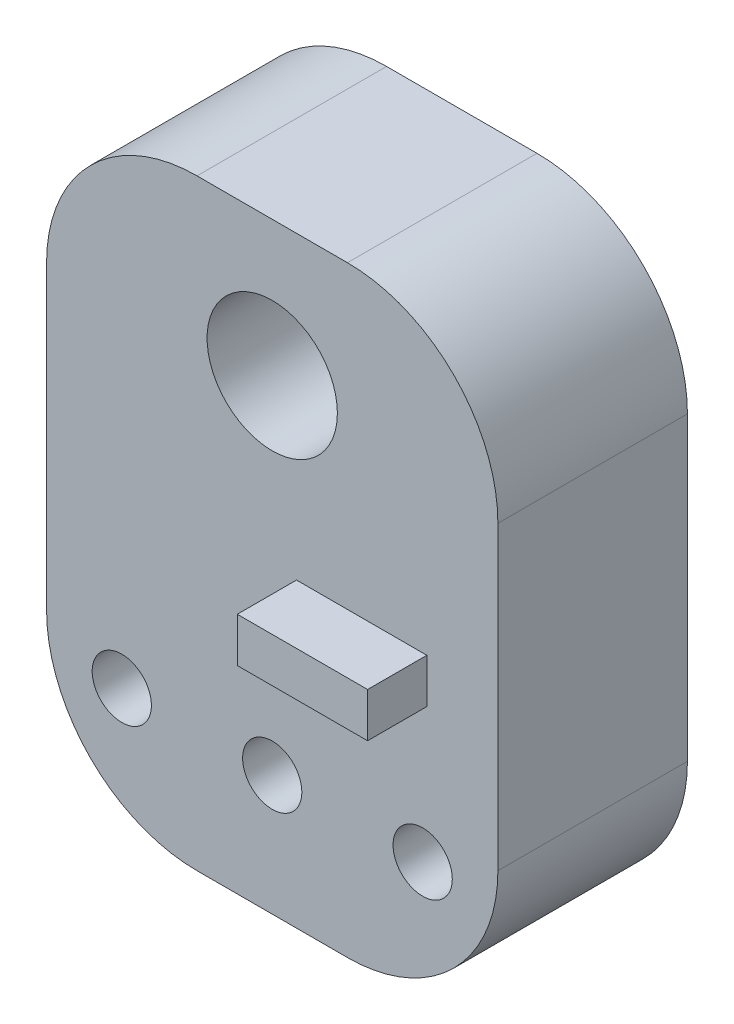
ISO-10303-21;
HEADER;
FILE_DESCRIPTION(('STEP AP214'),'2;1');
FILE_NAME('part.step','',(''),(''),'','','');
FILE_SCHEMA(('AUTOMOTIVE_DESIGN { 1 0 10303 214 1 1 1 1 }'));
ENDSEC;
DATA;
#1=APPLICATION_CONTEXT('core data for automotive mechanical design processes');
#2=APPLICATION_PROTOCOL_DEFINITION('international standard','automotive_design',2000,#1);
#3=PRODUCT_CONTEXT('',#1,'mechanical');
#4=PRODUCT('Part','Part','',(#3));
#5=PRODUCT_RELATED_PRODUCT_CATEGORY('part','',(#4));
#6=PRODUCT_DEFINITION_FORMATION('','',#4);
#7=PRODUCT_DEFINITION_CONTEXT('part definition',#1,'design');
#8=PRODUCT_DEFINITION('design','',#6,#7);
#9=PRODUCT_DEFINITION_SHAPE('','',#8);
#10=(LENGTH_UNIT() NAMED_UNIT(*) SI_UNIT(.MILLI.,.METRE.));
#11=(NAMED_UNIT(*) PLANE_ANGLE_UNIT() SI_UNIT($,.RADIAN.));
#12=(NAMED_UNIT(*) SI_UNIT($,.STERADIAN.) SOLID_ANGLE_UNIT());
#13=UNCERTAINTY_MEASURE_WITH_UNIT(LENGTH_MEASURE(1.E-05),#10,'distance_accuracy_value','');
#14=(GEOMETRIC_REPRESENTATION_CONTEXT(3) GLOBAL_UNCERTAINTY_ASSIGNED_CONTEXT((#13)) GLOBAL_UNIT_ASSIGNED_CONTEXT((#10,
#11,#12)) REPRESENTATION_CONTEXT('',''));
#15=CARTESIAN_POINT('',(0.,0.,0.));
#16=DIRECTION('',(0.,0.,1.));
#17=DIRECTION('',(1.,0.,0.));
#18=AXIS2_PLACEMENT_3D('',#15,#16,#17);
#19=CARTESIAN_POINT('',(20.068312942279,7.62,3.2));
#20=DIRECTION('',(0.,0.,1.));
#21=DIRECTION('',(1.,0.,0.));
#22=AXIS2_PLACEMENT_3D('',#19,#20,#21);
#23=PLANE('',#22);
#24=CARTESIAN_POINT('',(23.878312942279,2.032,3.2));
#25=DIRECTION('',(0.,0.,1.));
#26=DIRECTION('',(1.,0.,0.));
#27=AXIS2_PLACEMENT_3D('',#24,#25,#26);
#28=CIRCLE('',#27,0.499999999999999);
#29=CARTESIAN_POINT('',(24.378312942279,2.032,3.2));
#30=VERTEX_POINT('',#29);
#31=EDGE_CURVE('E207',#30,#30,#28,.T.);
#32=ORIENTED_EDGE('',*,*,#31,.F.);
#33=EDGE_LOOP('',(#32));
#34=FACE_BOUND('',#33,.T.);
#35=CARTESIAN_POINT('',(18.798312942279,2.032,3.2));
#36=DIRECTION('',(0.,0.,1.));
#37=DIRECTION('',(1.,0.,0.));
#38=AXIS2_PLACEMENT_3D('',#35,#36,#37);
#39=CIRCLE('',#38,0.499999999999999);
#40=CARTESIAN_POINT('',(19.298312942279,2.032,3.2));
#41=VERTEX_POINT('',#40);
#42=EDGE_CURVE('E152',#41,#41,#39,.T.);
#43=ORIENTED_EDGE('',*,*,#42,.F.);
#44=EDGE_LOOP('',(#43));
#45=FACE_BOUND('',#44,.T.);
#46=CARTESIAN_POINT('',(20.068312942279,7.62,3.2));
#47=DIRECTION('',(0.,0.,1.));
#48=DIRECTION('',(1.,0.,0.));
#49=AXIS2_PLACEMENT_3D('',#46,#47,#48);
#50=CIRCLE('',#49,2.54);
#51=CARTESIAN_POINT('',(20.068312942279,10.16,3.2));
#52=VERTEX_POINT('',#51);
#53=CARTESIAN_POINT('',(17.528312942279,7.62,3.2));
#54=VERTEX_POINT('',#53);
#55=EDGE_CURVE('E164',#52,#54,#50,.T.);
#56=ORIENTED_EDGE('',*,*,#55,.T.);
#57=DIRECTION('',(0.,-1.,0.));
#58=VECTOR('',#57,1.);
#59=CARTESIAN_POINT('',(17.528312942279,7.62,3.2));
#60=LINE('',#59,#58);
#61=CARTESIAN_POINT('',(17.528312942279,2.54,3.2));
#62=VERTEX_POINT('',#61);
#63=EDGE_CURVE('E104',#54,#62,#60,.T.);
#64=ORIENTED_EDGE('',*,*,#63,.T.);
#65=CARTESIAN_POINT('',(20.068312942279,2.54,3.2));
#66=DIRECTION('',(0.,0.,1.));
#67=DIRECTION('',(-1.,0.,0.));
#68=AXIS2_PLACEMENT_3D('',#65,#66,#67);
#69=CIRCLE('',#68,2.54);
#70=CARTESIAN_POINT('',(20.068312942279,0.,3.2));
#71=VERTEX_POINT('',#70);
#72=EDGE_CURVE('E179',#62,#71,#69,.T.);
#73=ORIENTED_EDGE('',*,*,#72,.T.);
#74=DIRECTION('',(1.,0.,0.));
#75=VECTOR('',#74,1.);
#76=CARTESIAN_POINT('',(22.608312942279,0.,3.2));
#77=LINE('',#76,#75);
#78=CARTESIAN_POINT('',(22.608312942279,0.,3.2));
#79=VERTEX_POINT('',#78);
#80=EDGE_CURVE('E192',#71,#79,#77,.T.);
#81=ORIENTED_EDGE('',*,*,#80,.T.);
#82=CARTESIAN_POINT('',(22.608312942279,2.54,3.2));
#83=DIRECTION('',(0.,0.,1.));
#84=DIRECTION('',(-1.,0.,0.));
#85=AXIS2_PLACEMENT_3D('',#82,#83,#84);
#86=CIRCLE('',#85,2.54);
#87=CARTESIAN_POINT('',(25.148312942279,2.54,3.2));
#88=VERTEX_POINT('',#87);
#89=EDGE_CURVE('E127',#79,#88,#86,.T.);
#90=ORIENTED_EDGE('',*,*,#89,.T.);
#91=DIRECTION('',(0.,1.,0.));
#92=VECTOR('',#91,1.);
#93=CARTESIAN_POINT('',(25.148312942279,7.62,3.2));
#94=LINE('',#93,#92);
#95=CARTESIAN_POINT('',(25.148312942279,7.62,3.2));
#96=VERTEX_POINT('',#95);
#97=EDGE_CURVE('E120',#88,#96,#94,.T.);
#98=ORIENTED_EDGE('',*,*,#97,.T.);
#99=CARTESIAN_POINT('',(22.608312942279,7.62,3.2));
#100=DIRECTION('',(0.,0.,1.));
#101=DIRECTION('',(-1.,0.,0.));
#102=AXIS2_PLACEMENT_3D('',#99,#100,#101);
#103=CIRCLE('',#102,2.54);
#104=CARTESIAN_POINT('',(22.608312942279,10.16,3.2));
#105=VERTEX_POINT('',#104);
#106=EDGE_CURVE('E124',#96,#105,#103,.T.);
#107=ORIENTED_EDGE('',*,*,#106,.T.);
#108=DIRECTION('',(-1.,0.,0.));
#109=VECTOR('',#108,1.);
#110=CARTESIAN_POINT('',(20.068312942279,10.16,3.2));
#111=LINE('',#110,#109);
#112=EDGE_CURVE('E63',#105,#52,#111,.T.);
#113=ORIENTED_EDGE('',*,*,#112,.T.);
#114=EDGE_LOOP('',(#56,#64,#73,#81,#90,#98,#107,#113));
#115=FACE_BOUND('',#114,.T.);
#116=CARTESIAN_POINT('',(21.338312942279,2.032,3.2));
#117=DIRECTION('',(0.,0.,1.));
#118=DIRECTION('',(1.,0.,0.));
#119=AXIS2_PLACEMENT_3D('',#116,#117,#118);
#120=CIRCLE('',#119,0.499999999999999);
#121=CARTESIAN_POINT('',(21.838312942279,2.032,3.2));
#122=VERTEX_POINT('',#121);
#123=EDGE_CURVE('E201',#122,#122,#120,.T.);
#124=ORIENTED_EDGE('',*,*,#123,.F.);
#125=EDGE_LOOP('',(#124));
#126=FACE_BOUND('',#125,.T.);
#127=CARTESIAN_POINT('',(21.338312942279,7.874,3.2));
#128=DIRECTION('',(0.,0.,1.));
#129=DIRECTION('',(1.,0.,0.));
#130=AXIS2_PLACEMENT_3D('',#127,#128,#129);
#131=CIRCLE('',#130,1.1);
#132=CARTESIAN_POINT('',(22.438312942279,7.874,3.2));
#133=VERTEX_POINT('',#132);
#134=EDGE_CURVE('E213',#133,#133,#131,.T.);
#135=ORIENTED_EDGE('',*,*,#134,.F.);
#136=EDGE_LOOP('',(#135));
#137=FACE_BOUND('',#136,.T.);
#138=DIRECTION('',(1.,0.,0.));
#139=VECTOR('',#138,1.);
#140=CARTESIAN_POINT('',(21.748312942279,4.34,3.2));
#141=LINE('',#140,#139);
#142=CARTESIAN_POINT('',(21.748312942279,4.34,3.2));
#143=VERTEX_POINT('',#142);
#144=CARTESIAN_POINT('',(23.948312942279,4.34,3.2));
#145=VERTEX_POINT('',#144);
#146=EDGE_CURVE('E237',#143,#145,#141,.T.);
#147=ORIENTED_EDGE('',*,*,#146,.F.);
#148=DIRECTION('',(0.,-1.,0.));
#149=VECTOR('',#148,1.);
#150=CARTESIAN_POINT('',(21.748312942279,5.09,3.2));
#151=LINE('',#150,#149);
#152=CARTESIAN_POINT('',(21.748312942279,5.09,3.2));
#153=VERTEX_POINT('',#152);
#154=EDGE_CURVE('E240',#153,#143,#151,.T.);
#155=ORIENTED_EDGE('',*,*,#154,.F.);
#156=DIRECTION('',(-1.,0.,0.));
#157=VECTOR('',#156,1.);
#158=CARTESIAN_POINT('',(21.748312942279,5.09,3.2));
#159=LINE('',#158,#157);
#160=CARTESIAN_POINT('',(23.948312942279,5.09,3.2));
#161=VERTEX_POINT('',#160);
#162=EDGE_CURVE('E232',#161,#153,#159,.T.);
#163=ORIENTED_EDGE('',*,*,#162,.F.);
#164=DIRECTION('',(0.,1.,0.));
#165=VECTOR('',#164,1.);
#166=CARTESIAN_POINT('',(23.948312942279,5.09,3.2));
#167=LINE('',#166,#165);
#168=EDGE_CURVE('E235',#145,#161,#167,.T.);
#169=ORIENTED_EDGE('',*,*,#168,.F.);
#170=EDGE_LOOP('',(#147,#155,#163,#169));
#171=FACE_BOUND('',#170,.T.);
#172=ADVANCED_FACE('F39',(#34,#45,#115,#126,#137,#171),#23,.T.);
#173=CARTESIAN_POINT('',(20.068312942279,7.62,0.));
#174=DIRECTION('',(0.,0.,1.));
#175=DIRECTION('',(1.,0.,0.));
#176=AXIS2_PLACEMENT_3D('',#173,#174,#175);
#177=PLANE('',#176);
#178=CARTESIAN_POINT('',(20.068312942279,7.62,0.));
#179=DIRECTION('',(0.,0.,1.));
#180=DIRECTION('',(1.,0.,0.));
#181=AXIS2_PLACEMENT_3D('',#178,#179,#180);
#182=CIRCLE('',#181,2.54);
#183=CARTESIAN_POINT('',(20.068312942279,10.16,0.));
#184=VERTEX_POINT('',#183);
#185=CARTESIAN_POINT('',(17.528312942279,7.62,0.));
#186=VERTEX_POINT('',#185);
#187=EDGE_CURVE('E148',#184,#186,#182,.T.);
#188=ORIENTED_EDGE('',*,*,#187,.F.);
#189=DIRECTION('',(-1.,0.,0.));
#190=VECTOR('',#189,1.);
#191=CARTESIAN_POINT('',(20.068312942279,10.16,0.));
#192=LINE('',#191,#190);
#193=CARTESIAN_POINT('',(22.608312942279,10.16,0.));
#194=VERTEX_POINT('',#193);
#195=EDGE_CURVE('E96',#194,#184,#192,.T.);
#196=ORIENTED_EDGE('',*,*,#195,.F.);
#197=CARTESIAN_POINT('',(22.608312942279,7.62,0.));
#198=DIRECTION('',(0.,0.,1.));
#199=DIRECTION('',(-1.,0.,0.));
#200=AXIS2_PLACEMENT_3D('',#197,#198,#199);
#201=CIRCLE('',#200,2.54);
#202=CARTESIAN_POINT('',(25.148312942279,7.62,0.));
#203=VERTEX_POINT('',#202);
#204=EDGE_CURVE('E161',#203,#194,#201,.T.);
#205=ORIENTED_EDGE('',*,*,#204,.F.);
#206=DIRECTION('',(0.,1.,0.));
#207=VECTOR('',#206,1.);
#208=CARTESIAN_POINT('',(25.148312942279,7.62,0.));
#209=LINE('',#208,#207);
#210=CARTESIAN_POINT('',(25.148312942279,2.54,0.));
#211=VERTEX_POINT('',#210);
#212=EDGE_CURVE('E136',#211,#203,#209,.T.);
#213=ORIENTED_EDGE('',*,*,#212,.F.);
#214=CARTESIAN_POINT('',(22.608312942279,2.54,0.));
#215=DIRECTION('',(0.,0.,1.));
#216=DIRECTION('',(-1.,0.,0.));
#217=AXIS2_PLACEMENT_3D('',#214,#215,#216);
#218=CIRCLE('',#217,2.54);
#219=CARTESIAN_POINT('',(22.608312942279,0.,0.));
#220=VERTEX_POINT('',#219);
#221=EDGE_CURVE('E158',#220,#211,#218,.T.);
#222=ORIENTED_EDGE('',*,*,#221,.F.);
#223=DIRECTION('',(1.,0.,0.));
#224=VECTOR('',#223,1.);
#225=CARTESIAN_POINT('',(22.608312942279,0.,0.));
#226=LINE('',#225,#224);
#227=CARTESIAN_POINT('',(20.068312942279,0.,0.));
#228=VERTEX_POINT('',#227);
#229=EDGE_CURVE('E156',#228,#220,#226,.T.);
#230=ORIENTED_EDGE('',*,*,#229,.F.);
#231=CARTESIAN_POINT('',(20.068312942279,2.54,0.));
#232=DIRECTION('',(0.,0.,1.));
#233=DIRECTION('',(-1.,0.,0.));
#234=AXIS2_PLACEMENT_3D('',#231,#232,#233);
#235=CIRCLE('',#234,2.54);
#236=CARTESIAN_POINT('',(17.528312942279,2.54,0.));
#237=VERTEX_POINT('',#236);
#238=EDGE_CURVE('E154',#237,#228,#235,.T.);
#239=ORIENTED_EDGE('',*,*,#238,.F.);
#240=DIRECTION('',(0.,-1.,0.));
#241=VECTOR('',#240,1.);
#242=CARTESIAN_POINT('',(17.528312942279,7.62,0.));
#243=LINE('',#242,#241);
#244=EDGE_CURVE('E151',#186,#237,#243,.T.);
#245=ORIENTED_EDGE('',*,*,#244,.F.);
#246=EDGE_LOOP('',(#188,#196,#205,#213,#222,#230,#239,#245));
#247=FACE_BOUND('',#246,.T.);
#248=CARTESIAN_POINT('',(18.798312942279,2.032,0.));
#249=DIRECTION('',(0.,0.,1.));
#250=DIRECTION('',(1.,0.,0.));
#251=AXIS2_PLACEMENT_3D('',#248,#249,#250);
#252=CIRCLE('',#251,0.499999999999999);
#253=CARTESIAN_POINT('',(19.298312942279,2.032,0.));
#254=VERTEX_POINT('',#253);
#255=EDGE_CURVE('E198',#254,#254,#252,.T.);
#256=ORIENTED_EDGE('',*,*,#255,.T.);
#257=EDGE_LOOP('',(#256));
#258=FACE_BOUND('',#257,.T.);
#259=CARTESIAN_POINT('',(21.338312942279,2.032,0.));
#260=DIRECTION('',(0.,0.,1.));
#261=DIRECTION('',(1.,0.,0.));
#262=AXIS2_PLACEMENT_3D('',#259,#260,#261);
#263=CIRCLE('',#262,0.499999999999999);
#264=CARTESIAN_POINT('',(21.838312942279,2.032,0.));
#265=VERTEX_POINT('',#264);
#266=EDGE_CURVE('E204',#265,#265,#263,.T.);
#267=ORIENTED_EDGE('',*,*,#266,.T.);
#268=EDGE_LOOP('',(#267));
#269=FACE_BOUND('',#268,.T.);
#270=CARTESIAN_POINT('',(23.878312942279,2.032,0.));
#271=DIRECTION('',(0.,0.,1.));
#272=DIRECTION('',(1.,0.,0.));
#273=AXIS2_PLACEMENT_3D('',#270,#271,#272);
#274=CIRCLE('',#273,0.499999999999999);
#275=CARTESIAN_POINT('',(24.378312942279,2.032,0.));
#276=VERTEX_POINT('',#275);
#277=EDGE_CURVE('E210',#276,#276,#274,.T.);
#278=ORIENTED_EDGE('',*,*,#277,.T.);
#279=EDGE_LOOP('',(#278));
#280=FACE_BOUND('',#279,.T.);
#281=CARTESIAN_POINT('',(21.338312942279,7.874,0.));
#282=DIRECTION('',(0.,0.,1.));
#283=DIRECTION('',(1.,0.,0.));
#284=AXIS2_PLACEMENT_3D('',#281,#282,#283);
#285=CIRCLE('',#284,1.1);
#286=CARTESIAN_POINT('',(22.438312942279,7.874,0.));
#287=VERTEX_POINT('',#286);
#288=EDGE_CURVE('E216',#287,#287,#285,.T.);
#289=ORIENTED_EDGE('',*,*,#288,.T.);
#290=EDGE_LOOP('',(#289));
#291=FACE_BOUND('',#290,.T.);
#292=ADVANCED_FACE('F183',(#247,#258,#269,#280,#291),#177,.F.);
#293=CARTESIAN_POINT('',(20.068312942279,7.62,3.2));
#294=DIRECTION('',(0.,0.,-1.));
#295=DIRECTION('',(-1.,0.,0.));
#296=AXIS2_PLACEMENT_3D('',#293,#294,#295);
#297=CYLINDRICAL_SURFACE('',#296,2.54);
#298=ORIENTED_EDGE('',*,*,#187,.T.);
#299=DIRECTION('',(0.,0.,-1.));
#300=VECTOR('',#299,1.);
#301=CARTESIAN_POINT('',(17.528312942279,7.62,3.2));
#302=LINE('',#301,#300);
#303=EDGE_CURVE('E11',#54,#186,#302,.T.);
#304=ORIENTED_EDGE('',*,*,#303,.F.);
#305=ORIENTED_EDGE('',*,*,#55,.F.);
#306=DIRECTION('',(0.,0.,-1.));
#307=VECTOR('',#306,1.);
#308=CARTESIAN_POINT('',(20.068312942279,10.16,3.2));
#309=LINE('',#308,#307);
#310=EDGE_CURVE('E144',#52,#184,#309,.T.);
#311=ORIENTED_EDGE('',*,*,#310,.T.);
#312=EDGE_LOOP('',(#298,#304,#305,#311));
#313=FACE_BOUND('',#312,.T.);
#314=ADVANCED_FACE('F41',(#313),#297,.T.);
#315=CARTESIAN_POINT('',(17.528312942279,7.62,3.2));
#316=DIRECTION('',(1.,0.,0.));
#317=DIRECTION('',(0.,1.,0.));
#318=AXIS2_PLACEMENT_3D('',#315,#316,#317);
#319=PLANE('',#318);
#320=ORIENTED_EDGE('',*,*,#244,.T.);
#321=DIRECTION('',(0.,0.,-1.));
#322=VECTOR('',#321,1.);
#323=CARTESIAN_POINT('',(17.528312942279,2.54,3.2));
#324=LINE('',#323,#322);
#325=EDGE_CURVE('E47',#62,#237,#324,.T.);
#326=ORIENTED_EDGE('',*,*,#325,.F.);
#327=ORIENTED_EDGE('',*,*,#63,.F.);
#328=ORIENTED_EDGE('',*,*,#303,.T.);
#329=EDGE_LOOP('',(#320,#326,#327,#328));
#330=FACE_BOUND('',#329,.T.);
#331=ADVANCED_FACE('F307',(#330),#319,.F.);
#332=CARTESIAN_POINT('',(20.068312942279,2.54,3.2));
#333=DIRECTION('',(0.,0.,-1.));
#334=DIRECTION('',(-1.,0.,0.));
#335=AXIS2_PLACEMENT_3D('',#332,#333,#334);
#336=CYLINDRICAL_SURFACE('',#335,2.54);
#337=ORIENTED_EDGE('',*,*,#238,.T.);
#338=DIRECTION('',(0.,0.,-1.));
#339=VECTOR('',#338,1.);
#340=CARTESIAN_POINT('',(20.068312942279,0.,3.2));
#341=LINE('',#340,#339);
#342=EDGE_CURVE('E171',#71,#228,#341,.T.);
#343=ORIENTED_EDGE('',*,*,#342,.F.);
#344=ORIENTED_EDGE('',*,*,#72,.F.);
#345=ORIENTED_EDGE('',*,*,#325,.T.);
#346=EDGE_LOOP('',(#337,#343,#344,#345));
#347=FACE_BOUND('',#346,.T.);
#348=ADVANCED_FACE('F177',(#347),#336,.T.);
#349=CARTESIAN_POINT('',(22.608312942279,0.,3.2));
#350=DIRECTION('',(0.,1.,0.));
#351=DIRECTION('',(-1.,0.,0.));
#352=AXIS2_PLACEMENT_3D('',#349,#350,#351);
#353=PLANE('',#352);
#354=ORIENTED_EDGE('',*,*,#229,.T.);
#355=DIRECTION('',(0.,0.,-1.));
#356=VECTOR('',#355,1.);
#357=CARTESIAN_POINT('',(22.608312942279,0.,3.2));
#358=LINE('',#357,#356);
#359=EDGE_CURVE('E168',#79,#220,#358,.T.);
#360=ORIENTED_EDGE('',*,*,#359,.F.);
#361=ORIENTED_EDGE('',*,*,#80,.F.);
#362=ORIENTED_EDGE('',*,*,#342,.T.);
#363=EDGE_LOOP('',(#354,#360,#361,#362));
#364=FACE_BOUND('',#363,.T.);
#365=ADVANCED_FACE('F188',(#364),#353,.F.);
#366=CARTESIAN_POINT('',(22.608312942279,2.54,3.2));
#367=DIRECTION('',(0.,0.,-1.));
#368=DIRECTION('',(-1.,0.,0.));
#369=AXIS2_PLACEMENT_3D('',#366,#367,#368);
#370=CYLINDRICAL_SURFACE('',#369,2.54);
#371=ORIENTED_EDGE('',*,*,#221,.T.);
#372=DIRECTION('',(0.,0.,-1.));
#373=VECTOR('',#372,1.);
#374=CARTESIAN_POINT('',(25.148312942279,2.54,3.2));
#375=LINE('',#374,#373);
#376=EDGE_CURVE('E139',#88,#211,#375,.T.);
#377=ORIENTED_EDGE('',*,*,#376,.F.);
#378=ORIENTED_EDGE('',*,*,#89,.F.);
#379=ORIENTED_EDGE('',*,*,#359,.T.);
#380=EDGE_LOOP('',(#371,#377,#378,#379));
#381=FACE_BOUND('',#380,.T.);
#382=ADVANCED_FACE('F191',(#381),#370,.T.);
#383=CARTESIAN_POINT('',(25.148312942279,7.62,3.2));
#384=DIRECTION('',(-1.,0.,0.));
#385=DIRECTION('',(0.,-1.,0.));
#386=AXIS2_PLACEMENT_3D('',#383,#384,#385);
#387=PLANE('',#386);
#388=ORIENTED_EDGE('',*,*,#212,.T.);
#389=DIRECTION('',(0.,0.,-1.));
#390=VECTOR('',#389,1.);
#391=CARTESIAN_POINT('',(25.148312942279,7.62,3.2));
#392=LINE('',#391,#390);
#393=EDGE_CURVE('E133',#96,#203,#392,.T.);
#394=ORIENTED_EDGE('',*,*,#393,.F.);
#395=ORIENTED_EDGE('',*,*,#97,.F.);
#396=ORIENTED_EDGE('',*,*,#376,.T.);
#397=EDGE_LOOP('',(#388,#394,#395,#396));
#398=FACE_BOUND('',#397,.T.);
#399=ADVANCED_FACE('F134',(#398),#387,.F.);
#400=CARTESIAN_POINT('',(22.608312942279,7.62,3.2));
#401=DIRECTION('',(0.,0.,-1.));
#402=DIRECTION('',(-1.,0.,0.));
#403=AXIS2_PLACEMENT_3D('',#400,#401,#402);
#404=CYLINDRICAL_SURFACE('',#403,2.54);
#405=ORIENTED_EDGE('',*,*,#204,.T.);
#406=DIRECTION('',(0.,0.,-1.));
#407=VECTOR('',#406,1.);
#408=CARTESIAN_POINT('',(22.608312942279,10.16,3.2));
#409=LINE('',#408,#407);
#410=EDGE_CURVE('E140',#105,#194,#409,.T.);
#411=ORIENTED_EDGE('',*,*,#410,.F.);
#412=ORIENTED_EDGE('',*,*,#106,.F.);
#413=ORIENTED_EDGE('',*,*,#393,.T.);
#414=EDGE_LOOP('',(#405,#411,#412,#413));
#415=FACE_BOUND('',#414,.T.);
#416=ADVANCED_FACE('F142',(#415),#404,.T.);
#417=CARTESIAN_POINT('',(20.068312942279,10.16,3.2));
#418=DIRECTION('',(0.,-1.,0.));
#419=DIRECTION('',(0.,0.,-1.));
#420=AXIS2_PLACEMENT_3D('',#417,#418,#419);
#421=PLANE('',#420);
#422=ORIENTED_EDGE('',*,*,#195,.T.);
#423=ORIENTED_EDGE('',*,*,#310,.F.);
#424=ORIENTED_EDGE('',*,*,#112,.F.);
#425=ORIENTED_EDGE('',*,*,#410,.T.);
#426=EDGE_LOOP('',(#422,#423,#424,#425));
#427=FACE_BOUND('',#426,.T.);
#428=ADVANCED_FACE('F295',(#427),#421,.F.);
#429=CARTESIAN_POINT('',(18.798312942279,2.032,3.2));
#430=DIRECTION('',(0.,0.,-1.));
#431=DIRECTION('',(-1.,0.,0.));
#432=AXIS2_PLACEMENT_3D('',#429,#430,#431);
#433=CYLINDRICAL_SURFACE('',#432,0.499999999999999);
#434=ORIENTED_EDGE('',*,*,#42,.T.);
#435=EDGE_LOOP('',(#434));
#436=FACE_BOUND('',#435,.T.);
#437=ORIENTED_EDGE('',*,*,#255,.F.);
#438=EDGE_LOOP('',(#437));
#439=FACE_BOUND('',#438,.T.);
#440=ADVANCED_FACE('F292',(#436,#439),#433,.F.);
#441=CARTESIAN_POINT('',(21.338312942279,2.032,3.2));
#442=DIRECTION('',(0.,0.,-1.));
#443=DIRECTION('',(-1.,0.,0.));
#444=AXIS2_PLACEMENT_3D('',#441,#442,#443);
#445=CYLINDRICAL_SURFACE('',#444,0.499999999999999);
#446=ORIENTED_EDGE('',*,*,#123,.T.);
#447=EDGE_LOOP('',(#446));
#448=FACE_BOUND('',#447,.T.);
#449=ORIENTED_EDGE('',*,*,#266,.F.);
#450=EDGE_LOOP('',(#449));
#451=FACE_BOUND('',#450,.T.);
#452=ADVANCED_FACE('F367',(#448,#451),#445,.F.);
#453=CARTESIAN_POINT('',(23.878312942279,2.032,3.2));
#454=DIRECTION('',(0.,0.,-1.));
#455=DIRECTION('',(-1.,0.,0.));
#456=AXIS2_PLACEMENT_3D('',#453,#454,#455);
#457=CYLINDRICAL_SURFACE('',#456,0.499999999999999);
#458=ORIENTED_EDGE('',*,*,#31,.T.);
#459=EDGE_LOOP('',(#458));
#460=FACE_BOUND('',#459,.T.);
#461=ORIENTED_EDGE('',*,*,#277,.F.);
#462=EDGE_LOOP('',(#461));
#463=FACE_BOUND('',#462,.T.);
#464=ADVANCED_FACE('F375',(#460,#463),#457,.F.);
#465=CARTESIAN_POINT('',(21.338312942279,7.874,3.2));
#466=DIRECTION('',(0.,0.,-1.));
#467=DIRECTION('',(-1.,0.,0.));
#468=AXIS2_PLACEMENT_3D('',#465,#466,#467);
#469=CYLINDRICAL_SURFACE('',#468,1.1);
#470=ORIENTED_EDGE('',*,*,#134,.T.);
#471=EDGE_LOOP('',(#470));
#472=FACE_BOUND('',#471,.T.);
#473=ORIENTED_EDGE('',*,*,#288,.F.);
#474=EDGE_LOOP('',(#473));
#475=FACE_BOUND('',#474,.T.);
#476=ADVANCED_FACE('F383',(#472,#475),#469,.F.);
#477=CARTESIAN_POINT('',(21.748312942279,5.09,4.2));
#478=DIRECTION('',(1.,0.,0.));
#479=DIRECTION('',(0.,0.,-1.));
#480=AXIS2_PLACEMENT_3D('',#477,#478,#479);
#481=PLANE('',#480);
#482=ORIENTED_EDGE('',*,*,#154,.T.);
#483=DIRECTION('',(0.,0.,-1.));
#484=VECTOR('',#483,1.);
#485=CARTESIAN_POINT('',(21.748312942279,4.34,4.2));
#486=LINE('',#485,#484);
#487=CARTESIAN_POINT('',(21.748312942279,4.34,4.2));
#488=VERTEX_POINT('',#487);
#489=EDGE_CURVE('E219',#488,#143,#486,.T.);
#490=ORIENTED_EDGE('',*,*,#489,.F.);
#491=DIRECTION('',(0.,-1.,0.));
#492=VECTOR('',#491,1.);
#493=CARTESIAN_POINT('',(21.748312942279,5.09,4.2));
#494=LINE('',#493,#492);
#495=CARTESIAN_POINT('',(21.748312942279,5.09,4.2));
#496=VERTEX_POINT('',#495);
#497=EDGE_CURVE('E234',#496,#488,#494,.T.);
#498=ORIENTED_EDGE('',*,*,#497,.F.);
#499=DIRECTION('',(0.,0.,-1.));
#500=VECTOR('',#499,1.);
#501=CARTESIAN_POINT('',(21.748312942279,5.09,4.2));
#502=LINE('',#501,#500);
#503=EDGE_CURVE('E228',#496,#153,#502,.T.);
#504=ORIENTED_EDGE('',*,*,#503,.T.);
#505=EDGE_LOOP('',(#482,#490,#498,#504));
#506=FACE_BOUND('',#505,.T.);
#507=ADVANCED_FACE('F263',(#506),#481,.F.);
#508=CARTESIAN_POINT('',(21.748312942279,4.34,4.2));
#509=DIRECTION('',(0.,1.,0.));
#510=DIRECTION('',(0.,0.,1.));
#511=AXIS2_PLACEMENT_3D('',#508,#509,#510);
#512=PLANE('',#511);
#513=ORIENTED_EDGE('',*,*,#146,.T.);
#514=DIRECTION('',(0.,0.,-1.));
#515=VECTOR('',#514,1.);
#516=CARTESIAN_POINT('',(23.948312942279,4.34,4.2));
#517=LINE('',#516,#515);
#518=CARTESIAN_POINT('',(23.948312942279,4.34,4.2));
#519=VERTEX_POINT('',#518);
#520=EDGE_CURVE('E224',#519,#145,#517,.T.);
#521=ORIENTED_EDGE('',*,*,#520,.F.);
#522=DIRECTION('',(1.,0.,0.));
#523=VECTOR('',#522,1.);
#524=CARTESIAN_POINT('',(21.748312942279,4.34,4.2));
#525=LINE('',#524,#523);
#526=EDGE_CURVE('E248',#488,#519,#525,.T.);
#527=ORIENTED_EDGE('',*,*,#526,.F.);
#528=ORIENTED_EDGE('',*,*,#489,.T.);
#529=EDGE_LOOP('',(#513,#521,#527,#528));
#530=FACE_BOUND('',#529,.T.);
#531=ADVANCED_FACE('F268',(#530),#512,.F.);
#532=CARTESIAN_POINT('',(23.948312942279,5.09,4.2));
#533=DIRECTION('',(-1.,0.,0.));
#534=DIRECTION('',(0.,0.,1.));
#535=AXIS2_PLACEMENT_3D('',#532,#533,#534);
#536=PLANE('',#535);
#537=ORIENTED_EDGE('',*,*,#168,.T.);
#538=DIRECTION('',(0.,0.,-1.));
#539=VECTOR('',#538,1.);
#540=CARTESIAN_POINT('',(23.948312942279,5.09,4.2));
#541=LINE('',#540,#539);
#542=CARTESIAN_POINT('',(23.948312942279,5.09,4.2));
#543=VERTEX_POINT('',#542);
#544=EDGE_CURVE('E54',#543,#161,#541,.T.);
#545=ORIENTED_EDGE('',*,*,#544,.F.);
#546=DIRECTION('',(0.,1.,0.));
#547=VECTOR('',#546,1.);
#548=CARTESIAN_POINT('',(23.948312942279,5.09,4.2));
#549=LINE('',#548,#547);
#550=EDGE_CURVE('E245',#519,#543,#549,.T.);
#551=ORIENTED_EDGE('',*,*,#550,.F.);
#552=ORIENTED_EDGE('',*,*,#520,.T.);
#553=EDGE_LOOP('',(#537,#545,#551,#552));
#554=FACE_BOUND('',#553,.T.);
#555=ADVANCED_FACE('F277',(#554),#536,.F.);
#556=CARTESIAN_POINT('',(21.748312942279,5.09,4.2));
#557=DIRECTION('',(0.,-1.,0.));
#558=DIRECTION('',(0.,0.,-1.));
#559=AXIS2_PLACEMENT_3D('',#556,#557,#558);
#560=PLANE('',#559);
#561=ORIENTED_EDGE('',*,*,#162,.T.);
#562=ORIENTED_EDGE('',*,*,#503,.F.);
#563=DIRECTION('',(-1.,0.,0.));
#564=VECTOR('',#563,1.);
#565=CARTESIAN_POINT('',(21.748312942279,5.09,4.2));
#566=LINE('',#565,#564);
#567=EDGE_CURVE('E231',#543,#496,#566,.T.);
#568=ORIENTED_EDGE('',*,*,#567,.F.);
#569=ORIENTED_EDGE('',*,*,#544,.T.);
#570=EDGE_LOOP('',(#561,#562,#568,#569));
#571=FACE_BOUND('',#570,.T.);
#572=ADVANCED_FACE('F280',(#571),#560,.F.);
#573=CARTESIAN_POINT('',(0.,0.,4.2));
#574=DIRECTION('',(0.,0.,1.));
#575=DIRECTION('',(1.,0.,0.));
#576=AXIS2_PLACEMENT_3D('',#573,#574,#575);
#577=PLANE('',#576);
#578=ORIENTED_EDGE('',*,*,#497,.T.);
#579=ORIENTED_EDGE('',*,*,#526,.T.);
#580=ORIENTED_EDGE('',*,*,#550,.T.);
#581=ORIENTED_EDGE('',*,*,#567,.T.);
#582=EDGE_LOOP('',(#578,#579,#580,#581));
#583=FACE_BOUND('',#582,.T.);
#584=ADVANCED_FACE('F256',(#583),#577,.T.);
#585=CLOSED_SHELL('',(#172,#292,#314,#331,#348,#365,#382,#399,#416,#428,#440,#452,#464,#476,
#507,#531,#555,#572,#584));
#586=MANIFOLD_SOLID_BREP('B2',#585);
#587=ADVANCED_BREP_SHAPE_REPRESENTATION('',(#18,#586),#14);
#588=SHAPE_DEFINITION_REPRESENTATION(#9,#587);
ENDSEC;
END-ISO-10303-21;
